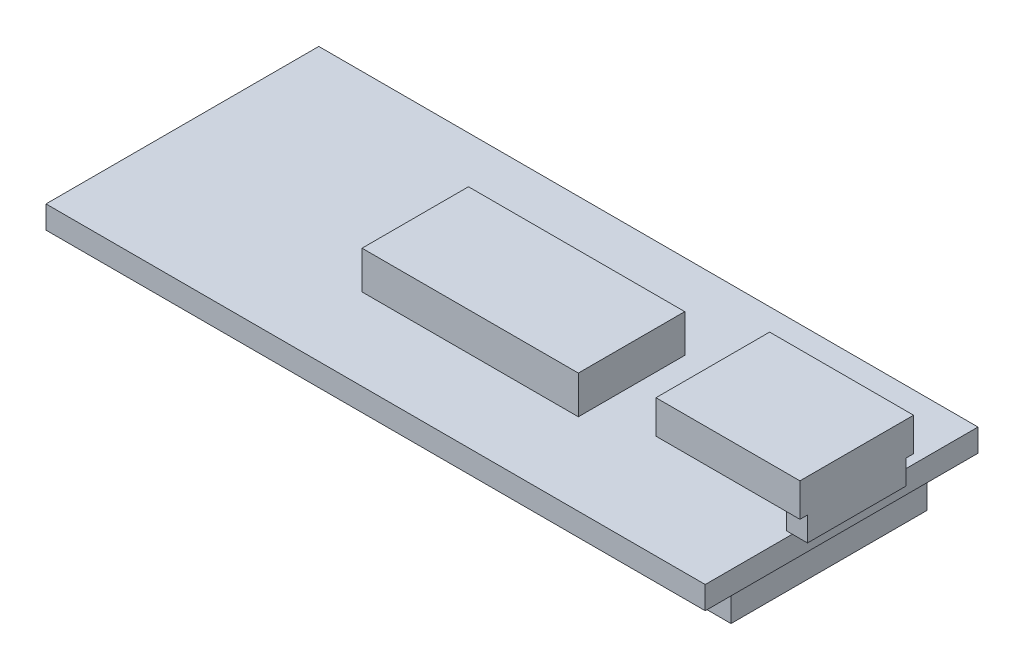
ISO-10303-21;
HEADER;
FILE_DESCRIPTION(('STEP AP214'),'2;1');
FILE_NAME('part.step','',(''),(''),'','','');
FILE_SCHEMA(('AUTOMOTIVE_DESIGN { 1 0 10303 214 1 1 1 1 }'));
ENDSEC;
DATA;
#1=APPLICATION_CONTEXT('core data for automotive mechanical design processes');
#2=APPLICATION_PROTOCOL_DEFINITION('international standard','automotive_design',2000,#1);
#3=PRODUCT_CONTEXT('',#1,'mechanical');
#4=PRODUCT('Part','Part','',(#3));
#5=PRODUCT_RELATED_PRODUCT_CATEGORY('part','',(#4));
#6=PRODUCT_DEFINITION_FORMATION('','',#4);
#7=PRODUCT_DEFINITION_CONTEXT('part definition',#1,'design');
#8=PRODUCT_DEFINITION('design','',#6,#7);
#9=PRODUCT_DEFINITION_SHAPE('','',#8);
#10=(LENGTH_UNIT() NAMED_UNIT(*) SI_UNIT(.MILLI.,.METRE.));
#11=(NAMED_UNIT(*) PLANE_ANGLE_UNIT() SI_UNIT($,.RADIAN.));
#12=(NAMED_UNIT(*) SI_UNIT($,.STERADIAN.) SOLID_ANGLE_UNIT());
#13=UNCERTAINTY_MEASURE_WITH_UNIT(LENGTH_MEASURE(1.E-05),#10,'distance_accuracy_value','');
#14=(GEOMETRIC_REPRESENTATION_CONTEXT(3) GLOBAL_UNCERTAINTY_ASSIGNED_CONTEXT((#13)) GLOBAL_UNIT_ASSIGNED_CONTEXT((#10,
#11,#12)) REPRESENTATION_CONTEXT('',''));
#15=CARTESIAN_POINT('',(0.,0.,0.));
#16=DIRECTION('',(0.,0.,1.));
#17=DIRECTION('',(1.,0.,0.));
#18=AXIS2_PLACEMENT_3D('',#15,#16,#17);
#19=CARTESIAN_POINT('',(0.,1.5,0.));
#20=DIRECTION('',(0.,-1.,0.));
#21=DIRECTION('',(0.,0.,-1.));
#22=AXIS2_PLACEMENT_3D('',#19,#20,#21);
#23=PLANE('',#22);
#24=DIRECTION('',(0.,0.,-1.));
#25=VECTOR('',#24,1.);
#26=CARTESIAN_POINT('',(43.1236382796243,1.5,-5.75));
#27=LINE('',#26,#25);
#28=CARTESIAN_POINT('',(43.1236382796243,1.5,-5.75));
#29=VERTEX_POINT('',#28);
#30=CARTESIAN_POINT('',(43.1236382796243,1.5,-12.25));
#31=VERTEX_POINT('',#30);
#32=EDGE_CURVE('E293',#29,#31,#27,.T.);
#33=ORIENTED_EDGE('',*,*,#32,.T.);
#34=DIRECTION('',(1.,0.,0.));
#35=VECTOR('',#34,1.);
#36=CARTESIAN_POINT('',(43.1236382796243,1.5,-12.25));
#37=LINE('',#36,#35);
#38=CARTESIAN_POINT('',(43.5,1.5,-12.25));
#39=VERTEX_POINT('',#38);
#40=EDGE_CURVE('E294',#31,#39,#37,.T.);
#41=ORIENTED_EDGE('',*,*,#40,.T.);
#42=DIRECTION('',(0.,0.,-1.));
#43=VECTOR('',#42,1.);
#44=CARTESIAN_POINT('',(43.5,1.5,0.));
#45=LINE('',#44,#43);
#46=CARTESIAN_POINT('',(43.5,1.5,-18.));
#47=VERTEX_POINT('',#46);
#48=EDGE_CURVE('E320',#39,#47,#45,.T.);
#49=ORIENTED_EDGE('',*,*,#48,.T.);
#50=DIRECTION('',(-1.,0.,0.));
#51=VECTOR('',#50,1.);
#52=CARTESIAN_POINT('',(0.,1.5,-18.));
#53=LINE('',#52,#51);
#54=CARTESIAN_POINT('',(0.,1.5,-18.));
#55=VERTEX_POINT('',#54);
#56=EDGE_CURVE('E324',#47,#55,#53,.T.);
#57=ORIENTED_EDGE('',*,*,#56,.T.);
#58=DIRECTION('',(0.,0.,1.));
#59=VECTOR('',#58,1.);
#60=CARTESIAN_POINT('',(0.,1.5,0.));
#61=LINE('',#60,#59);
#62=CARTESIAN_POINT('',(0.,1.5,0.));
#63=VERTEX_POINT('',#62);
#64=EDGE_CURVE('E314',#55,#63,#61,.T.);
#65=ORIENTED_EDGE('',*,*,#64,.T.);
#66=DIRECTION('',(1.,0.,0.));
#67=VECTOR('',#66,1.);
#68=CARTESIAN_POINT('',(0.,1.5,0.));
#69=LINE('',#68,#67);
#70=CARTESIAN_POINT('',(43.5,1.5,0.));
#71=VERTEX_POINT('',#70);
#72=EDGE_CURVE('E317',#63,#71,#69,.T.);
#73=ORIENTED_EDGE('',*,*,#72,.T.);
#74=CARTESIAN_POINT('',(43.5,1.5,-5.75));
#75=VERTEX_POINT('',#74);
#76=EDGE_CURVE('E321',#71,#75,#45,.T.);
#77=ORIENTED_EDGE('',*,*,#76,.T.);
#78=DIRECTION('',(1.,0.,0.));
#79=VECTOR('',#78,1.);
#80=CARTESIAN_POINT('',(43.1236382796243,1.5,-5.75));
#81=LINE('',#80,#79);
#82=EDGE_CURVE('E301',#29,#75,#81,.T.);
#83=ORIENTED_EDGE('',*,*,#82,.F.);
#84=EDGE_LOOP('',(#33,#41,#49,#57,#65,#73,#77,#83));
#85=FACE_BOUND('',#84,.T.);
#86=DIRECTION('',(1.,0.,0.));
#87=VECTOR('',#86,1.);
#88=CARTESIAN_POINT('',(15.4577253615621,1.5,-5.39734081677448));
#89=LINE('',#88,#87);
#90=CARTESIAN_POINT('',(15.4577253615621,1.5,-5.39734081677448));
#91=VERTEX_POINT('',#90);
#92=CARTESIAN_POINT('',(29.7306808517931,1.5,-5.39734081677448));
#93=VERTEX_POINT('',#92);
#94=EDGE_CURVE('E195',#91,#93,#89,.T.);
#95=ORIENTED_EDGE('',*,*,#94,.F.);
#96=DIRECTION('',(0.,0.,1.));
#97=VECTOR('',#96,1.);
#98=CARTESIAN_POINT('',(15.4577253615621,1.5,-12.4190841929975));
#99=LINE('',#98,#97);
#100=CARTESIAN_POINT('',(15.4577253615621,1.5,-12.4190841929975));
#101=VERTEX_POINT('',#100);
#102=EDGE_CURVE('E190',#101,#91,#99,.T.);
#103=ORIENTED_EDGE('',*,*,#102,.F.);
#104=DIRECTION('',(1.,0.,0.));
#105=VECTOR('',#104,1.);
#106=CARTESIAN_POINT('',(15.4577253615621,1.5,-12.4190841929975));
#107=LINE('',#106,#105);
#108=CARTESIAN_POINT('',(29.7306808517931,1.5,-12.4190841929975));
#109=VERTEX_POINT('',#108);
#110=EDGE_CURVE('E56',#101,#109,#107,.T.);
#111=ORIENTED_EDGE('',*,*,#110,.T.);
#112=DIRECTION('',(0.,0.,1.));
#113=VECTOR('',#112,1.);
#114=CARTESIAN_POINT('',(29.7306808517931,1.5,-12.4190841929975));
#115=LINE('',#114,#113);
#116=EDGE_CURVE('E51',#109,#93,#115,.T.);
#117=ORIENTED_EDGE('',*,*,#116,.T.);
#118=EDGE_LOOP('',(#95,#103,#111,#117));
#119=FACE_BOUND('',#118,.T.);
#120=ADVANCED_FACE('F36',(#85,#119),#23,.F.);
#121=CARTESIAN_POINT('',(43.1236382796243,5.3,-12.25));
#122=DIRECTION('',(0.,0.,-1.));
#123=DIRECTION('',(-1.,0.,0.));
#124=AXIS2_PLACEMENT_3D('',#121,#122,#123);
#125=PLANE('',#124);
#126=DIRECTION('',(0.,-1.,0.));
#127=VECTOR('',#126,1.);
#128=CARTESIAN_POINT('',(43.1236382796243,5.3,-12.25));
#129=LINE('',#128,#127);
#130=CARTESIAN_POINT('',(43.1236382796243,3.1,-12.25));
#131=VERTEX_POINT('',#130);
#132=EDGE_CURVE('E306',#131,#31,#129,.T.);
#133=ORIENTED_EDGE('',*,*,#132,.F.);
#134=DIRECTION('',(1.,0.,0.));
#135=VECTOR('',#134,1.);
#136=CARTESIAN_POINT('',(43.1236382796243,3.1,-12.25));
#137=LINE('',#136,#135);
#138=CARTESIAN_POINT('',(44.5,3.1,-12.25));
#139=VERTEX_POINT('',#138);
#140=EDGE_CURVE('E286',#131,#139,#137,.T.);
#141=ORIENTED_EDGE('',*,*,#140,.T.);
#142=DIRECTION('',(0.,-1.,0.));
#143=VECTOR('',#142,1.);
#144=CARTESIAN_POINT('',(44.5,5.3,-12.25));
#145=LINE('',#144,#143);
#146=CARTESIAN_POINT('',(44.5,1.5,-12.25));
#147=VERTEX_POINT('',#146);
#148=EDGE_CURVE('E292',#139,#147,#145,.T.);
#149=ORIENTED_EDGE('',*,*,#148,.T.);
#150=EDGE_CURVE('E289',#39,#147,#37,.T.);
#151=ORIENTED_EDGE('',*,*,#150,.F.);
#152=ORIENTED_EDGE('',*,*,#40,.F.);
#153=EDGE_LOOP('',(#133,#141,#149,#151,#152));
#154=FACE_BOUND('',#153,.T.);
#155=ADVANCED_FACE('F370',(#154),#125,.T.);
#156=CARTESIAN_POINT('',(43.1236382796243,5.3,-5.75));
#157=DIRECTION('',(-1.,0.,0.));
#158=DIRECTION('',(0.,0.,1.));
#159=AXIS2_PLACEMENT_3D('',#156,#157,#158);
#160=PLANE('',#159);
#161=DIRECTION('',(0.,-1.,0.));
#162=VECTOR('',#161,1.);
#163=CARTESIAN_POINT('',(43.1236382796243,5.3,-5.75));
#164=LINE('',#163,#162);
#165=CARTESIAN_POINT('',(43.1236382796243,3.1,-5.75));
#166=VERTEX_POINT('',#165);
#167=EDGE_CURVE('E309',#166,#29,#164,.T.);
#168=ORIENTED_EDGE('',*,*,#167,.F.);
#169=DIRECTION('',(0.,0.,-1.));
#170=VECTOR('',#169,1.);
#171=CARTESIAN_POINT('',(43.1236382796243,3.1,-5.75));
#172=LINE('',#171,#170);
#173=EDGE_CURVE('E283',#166,#131,#172,.T.);
#174=ORIENTED_EDGE('',*,*,#173,.T.);
#175=ORIENTED_EDGE('',*,*,#132,.T.);
#176=ORIENTED_EDGE('',*,*,#32,.F.);
#177=EDGE_LOOP('',(#168,#174,#175,#176));
#178=FACE_BOUND('',#177,.T.);
#179=ADVANCED_FACE('F384',(#178),#160,.T.);
#180=CARTESIAN_POINT('',(43.1236382796243,5.3,-5.75));
#181=DIRECTION('',(0.,0.,-1.));
#182=DIRECTION('',(-1.,0.,0.));
#183=AXIS2_PLACEMENT_3D('',#180,#181,#182);
#184=PLANE('',#183);
#185=DIRECTION('',(1.,0.,0.));
#186=VECTOR('',#185,1.);
#187=CARTESIAN_POINT('',(43.1236382796243,3.1,-5.75));
#188=LINE('',#187,#186);
#189=CARTESIAN_POINT('',(44.5,3.1,-5.75));
#190=VERTEX_POINT('',#189);
#191=EDGE_CURVE('E274',#166,#190,#188,.T.);
#192=ORIENTED_EDGE('',*,*,#191,.F.);
#193=ORIENTED_EDGE('',*,*,#167,.T.);
#194=ORIENTED_EDGE('',*,*,#82,.T.);
#195=CARTESIAN_POINT('',(44.5,1.5,-5.75));
#196=VERTEX_POINT('',#195);
#197=EDGE_CURVE('E300',#75,#196,#81,.T.);
#198=ORIENTED_EDGE('',*,*,#197,.T.);
#199=DIRECTION('',(0.,-1.,0.));
#200=VECTOR('',#199,1.);
#201=CARTESIAN_POINT('',(44.5,5.3,-5.75));
#202=LINE('',#201,#200);
#203=EDGE_CURVE('E311',#190,#196,#202,.T.);
#204=ORIENTED_EDGE('',*,*,#203,.F.);
#205=EDGE_LOOP('',(#192,#193,#194,#198,#204));
#206=FACE_BOUND('',#205,.T.);
#207=ADVANCED_FACE('F379',(#206),#184,.F.);
#208=CARTESIAN_POINT('',(0.,1.5,0.));
#209=DIRECTION('',(1.,0.,0.));
#210=DIRECTION('',(0.,0.,-1.));
#211=AXIS2_PLACEMENT_3D('',#208,#209,#210);
#212=PLANE('',#211);
#213=DIRECTION('',(0.,0.,1.));
#214=VECTOR('',#213,1.);
#215=CARTESIAN_POINT('',(0.,0.,0.));
#216=LINE('',#215,#214);
#217=CARTESIAN_POINT('',(0.,0.,-18.));
#218=VERTEX_POINT('',#217);
#219=CARTESIAN_POINT('',(0.,0.,0.));
#220=VERTEX_POINT('',#219);
#221=EDGE_CURVE('E308',#218,#220,#216,.T.);
#222=ORIENTED_EDGE('',*,*,#221,.T.);
#223=DIRECTION('',(0.,-1.,0.));
#224=VECTOR('',#223,1.);
#225=CARTESIAN_POINT('',(0.,1.5,0.));
#226=LINE('',#225,#224);
#227=EDGE_CURVE('E11',#63,#220,#226,.T.);
#228=ORIENTED_EDGE('',*,*,#227,.F.);
#229=ORIENTED_EDGE('',*,*,#64,.F.);
#230=DIRECTION('',(0.,-1.,0.));
#231=VECTOR('',#230,1.);
#232=CARTESIAN_POINT('',(0.,1.5,-18.));
#233=LINE('',#232,#231);
#234=EDGE_CURVE('E327',#55,#218,#233,.T.);
#235=ORIENTED_EDGE('',*,*,#234,.T.);
#236=EDGE_LOOP('',(#222,#228,#229,#235));
#237=FACE_BOUND('',#236,.T.);
#238=ADVANCED_FACE('F38',(#237),#212,.F.);
#239=CARTESIAN_POINT('',(0.,1.5,0.));
#240=DIRECTION('',(0.,0.,-1.));
#241=DIRECTION('',(-1.,0.,0.));
#242=AXIS2_PLACEMENT_3D('',#239,#240,#241);
#243=PLANE('',#242);
#244=DIRECTION('',(1.,0.,0.));
#245=VECTOR('',#244,1.);
#246=CARTESIAN_POINT('',(0.,0.,0.));
#247=LINE('',#246,#245);
#248=CARTESIAN_POINT('',(43.5,0.,0.));
#249=VERTEX_POINT('',#248);
#250=EDGE_CURVE('E330',#220,#249,#247,.T.);
#251=ORIENTED_EDGE('',*,*,#250,.T.);
#252=DIRECTION('',(0.,-1.,0.));
#253=VECTOR('',#252,1.);
#254=CARTESIAN_POINT('',(43.5,1.5,0.));
#255=LINE('',#254,#253);
#256=EDGE_CURVE('E44',#71,#249,#255,.T.);
#257=ORIENTED_EDGE('',*,*,#256,.F.);
#258=ORIENTED_EDGE('',*,*,#72,.F.);
#259=ORIENTED_EDGE('',*,*,#227,.T.);
#260=EDGE_LOOP('',(#251,#257,#258,#259));
#261=FACE_BOUND('',#260,.T.);
#262=ADVANCED_FACE('F424',(#261),#243,.F.);
#263=CARTESIAN_POINT('',(43.5,1.5,0.));
#264=DIRECTION('',(-1.,0.,0.));
#265=DIRECTION('',(0.,0.,1.));
#266=AXIS2_PLACEMENT_3D('',#263,#264,#265);
#267=PLANE('',#266);
#268=DIRECTION('',(0.,0.,-1.));
#269=VECTOR('',#268,1.);
#270=CARTESIAN_POINT('',(43.5,0.,0.));
#271=LINE('',#270,#269);
#272=CARTESIAN_POINT('',(43.5,0.,-18.));
#273=VERTEX_POINT('',#272);
#274=EDGE_CURVE('E332',#249,#273,#271,.T.);
#275=ORIENTED_EDGE('',*,*,#274,.T.);
#276=DIRECTION('',(0.,-1.,0.));
#277=VECTOR('',#276,1.);
#278=CARTESIAN_POINT('',(43.5,1.5,-18.));
#279=LINE('',#278,#277);
#280=EDGE_CURVE('E337',#47,#273,#279,.T.);
#281=ORIENTED_EDGE('',*,*,#280,.F.);
#282=ORIENTED_EDGE('',*,*,#48,.F.);
#283=EDGE_CURVE('E325',#75,#39,#45,.T.);
#284=ORIENTED_EDGE('',*,*,#283,.F.);
#285=ORIENTED_EDGE('',*,*,#76,.F.);
#286=ORIENTED_EDGE('',*,*,#256,.T.);
#287=EDGE_LOOP('',(#275,#281,#282,#284,#285,#286));
#288=FACE_BOUND('',#287,.T.);
#289=ADVANCED_FACE('F344',(#288),#267,.F.);
#290=CARTESIAN_POINT('',(0.,1.5,-18.));
#291=DIRECTION('',(0.,0.,1.));
#292=DIRECTION('',(1.,0.,0.));
#293=AXIS2_PLACEMENT_3D('',#290,#291,#292);
#294=PLANE('',#293);
#295=DIRECTION('',(-1.,0.,0.));
#296=VECTOR('',#295,1.);
#297=CARTESIAN_POINT('',(0.,0.,-18.));
#298=LINE('',#297,#296);
#299=EDGE_CURVE('E318',#273,#218,#298,.T.);
#300=ORIENTED_EDGE('',*,*,#299,.T.);
#301=ORIENTED_EDGE('',*,*,#234,.F.);
#302=ORIENTED_EDGE('',*,*,#56,.F.);
#303=ORIENTED_EDGE('',*,*,#280,.T.);
#304=EDGE_LOOP('',(#300,#301,#302,#303));
#305=FACE_BOUND('',#304,.T.);
#306=ADVANCED_FACE('F354',(#305),#294,.F.);
#307=CARTESIAN_POINT('',(0.,0.,0.));
#308=DIRECTION('',(0.,-1.,0.));
#309=DIRECTION('',(0.,0.,-1.));
#310=AXIS2_PLACEMENT_3D('',#307,#308,#309);
#311=PLANE('',#310);
#312=DIRECTION('',(0.,0.,-1.));
#313=VECTOR('',#312,1.);
#314=CARTESIAN_POINT('',(2.47704764683477,0.,-15.5464770542721));
#315=LINE('',#314,#313);
#316=CARTESIAN_POINT('',(2.47704764683477,0.,-2.61819635693428));
#317=VERTEX_POINT('',#316);
#318=CARTESIAN_POINT('',(2.47704764683477,0.,-15.5464770542721));
#319=VERTEX_POINT('',#318);
#320=EDGE_CURVE('E197',#317,#319,#315,.T.);
#321=ORIENTED_EDGE('',*,*,#320,.F.);
#322=DIRECTION('',(-1.,0.,0.));
#323=VECTOR('',#322,1.);
#324=CARTESIAN_POINT('',(2.47704764683477,0.,-2.61819635693428));
#325=LINE('',#324,#323);
#326=CARTESIAN_POINT('',(42.5846508932892,0.,-2.61819635693428));
#327=VERTEX_POINT('',#326);
#328=EDGE_CURVE('E221',#327,#317,#325,.T.);
#329=ORIENTED_EDGE('',*,*,#328,.F.);
#330=DIRECTION('',(0.,0.,1.));
#331=VECTOR('',#330,1.);
#332=CARTESIAN_POINT('',(42.5846508932892,0.,-15.5464770542721));
#333=LINE('',#332,#331);
#334=CARTESIAN_POINT('',(42.5846508932892,0.,-15.5464770542721));
#335=VERTEX_POINT('',#334);
#336=EDGE_CURVE('E233',#335,#327,#333,.T.);
#337=ORIENTED_EDGE('',*,*,#336,.F.);
#338=DIRECTION('',(1.,0.,0.));
#339=VECTOR('',#338,1.);
#340=CARTESIAN_POINT('',(2.47704764683477,0.,-15.5464770542721));
#341=LINE('',#340,#339);
#342=EDGE_CURVE('E230',#319,#335,#341,.T.);
#343=ORIENTED_EDGE('',*,*,#342,.F.);
#344=EDGE_LOOP('',(#321,#329,#337,#343));
#345=FACE_BOUND('',#344,.T.);
#346=ORIENTED_EDGE('',*,*,#221,.F.);
#347=ORIENTED_EDGE('',*,*,#299,.F.);
#348=ORIENTED_EDGE('',*,*,#274,.F.);
#349=ORIENTED_EDGE('',*,*,#250,.F.);
#350=EDGE_LOOP('',(#346,#347,#348,#349));
#351=FACE_BOUND('',#350,.T.);
#352=ADVANCED_FACE('F351',(#345,#351),#311,.T.);
#353=CARTESIAN_POINT('',(0.,1.5,0.));
#354=DIRECTION('',(0.,1.,0.));
#355=DIRECTION('',(0.,0.,1.));
#356=AXIS2_PLACEMENT_3D('',#353,#354,#355);
#357=PLANE('',#356);
#358=ORIENTED_EDGE('',*,*,#197,.F.);
#359=ORIENTED_EDGE('',*,*,#283,.T.);
#360=ORIENTED_EDGE('',*,*,#150,.T.);
#361=DIRECTION('',(0.,0.,-1.));
#362=VECTOR('',#361,1.);
#363=CARTESIAN_POINT('',(44.5,1.5,-5.75));
#364=LINE('',#363,#362);
#365=EDGE_CURVE('E297',#196,#147,#364,.T.);
#366=ORIENTED_EDGE('',*,*,#365,.F.);
#367=EDGE_LOOP('',(#358,#359,#360,#366));
#368=FACE_BOUND('',#367,.T.);
#369=ADVANCED_FACE('F365',(#368),#357,.F.);
#370=CARTESIAN_POINT('',(44.5,5.3,-5.75));
#371=DIRECTION('',(-1.,0.,0.));
#372=DIRECTION('',(0.,0.,1.));
#373=AXIS2_PLACEMENT_3D('',#370,#371,#372);
#374=PLANE('',#373);
#375=DIRECTION('',(0.,0.,-1.));
#376=VECTOR('',#375,1.);
#377=CARTESIAN_POINT('',(44.5,5.3,-5.75));
#378=LINE('',#377,#376);
#379=CARTESIAN_POINT('',(44.5,5.3,-5.25));
#380=VERTEX_POINT('',#379);
#381=CARTESIAN_POINT('',(44.5,5.3,-12.75));
#382=VERTEX_POINT('',#381);
#383=EDGE_CURVE('E290',#380,#382,#378,.T.);
#384=ORIENTED_EDGE('',*,*,#383,.F.);
#385=DIRECTION('',(0.,1.,0.));
#386=VECTOR('',#385,1.);
#387=CARTESIAN_POINT('',(44.5,3.1,-5.25));
#388=LINE('',#387,#386);
#389=CARTESIAN_POINT('',(44.5,3.1,-5.25));
#390=VERTEX_POINT('',#389);
#391=EDGE_CURVE('E278',#390,#380,#388,.T.);
#392=ORIENTED_EDGE('',*,*,#391,.F.);
#393=DIRECTION('',(0.,0.,-1.));
#394=VECTOR('',#393,1.);
#395=CARTESIAN_POINT('',(44.5,3.1,-12.75));
#396=LINE('',#395,#394);
#397=EDGE_CURVE('E258',#390,#190,#396,.T.);
#398=ORIENTED_EDGE('',*,*,#397,.T.);
#399=ORIENTED_EDGE('',*,*,#203,.T.);
#400=ORIENTED_EDGE('',*,*,#365,.T.);
#401=ORIENTED_EDGE('',*,*,#148,.F.);
#402=CARTESIAN_POINT('',(44.5,3.1,-12.75));
#403=VERTEX_POINT('',#402);
#404=EDGE_CURVE('E257',#139,#403,#396,.T.);
#405=ORIENTED_EDGE('',*,*,#404,.T.);
#406=DIRECTION('',(0.,1.,0.));
#407=VECTOR('',#406,1.);
#408=CARTESIAN_POINT('',(44.5,3.1,-12.75));
#409=LINE('',#408,#407);
#410=EDGE_CURVE('E275',#403,#382,#409,.T.);
#411=ORIENTED_EDGE('',*,*,#410,.T.);
#412=EDGE_LOOP('',(#384,#392,#398,#399,#400,#401,#405,#411));
#413=FACE_BOUND('',#412,.T.);
#414=ADVANCED_FACE('F373',(#413),#374,.F.);
#415=CARTESIAN_POINT('',(0.,5.3,0.));
#416=DIRECTION('',(0.,1.,0.));
#417=DIRECTION('',(0.,0.,1.));
#418=AXIS2_PLACEMENT_3D('',#415,#416,#417);
#419=PLANE('',#418);
#420=ORIENTED_EDGE('',*,*,#383,.T.);
#421=DIRECTION('',(-1.,0.,0.));
#422=VECTOR('',#421,1.);
#423=CARTESIAN_POINT('',(35.,5.3,-12.75));
#424=LINE('',#423,#422);
#425=CARTESIAN_POINT('',(35.,5.3,-12.75));
#426=VERTEX_POINT('',#425);
#427=EDGE_CURVE('E254',#382,#426,#424,.T.);
#428=ORIENTED_EDGE('',*,*,#427,.T.);
#429=DIRECTION('',(0.,0.,1.));
#430=VECTOR('',#429,1.);
#431=CARTESIAN_POINT('',(35.,5.3,-12.75));
#432=LINE('',#431,#430);
#433=CARTESIAN_POINT('',(35.,5.3,-5.25));
#434=VERTEX_POINT('',#433);
#435=EDGE_CURVE('E249',#426,#434,#432,.T.);
#436=ORIENTED_EDGE('',*,*,#435,.T.);
#437=DIRECTION('',(1.,0.,0.));
#438=VECTOR('',#437,1.);
#439=CARTESIAN_POINT('',(35.,5.3,-5.25));
#440=LINE('',#439,#438);
#441=EDGE_CURVE('E267',#434,#380,#440,.T.);
#442=ORIENTED_EDGE('',*,*,#441,.T.);
#443=EDGE_LOOP('',(#420,#428,#436,#442));
#444=FACE_BOUND('',#443,.T.);
#445=ADVANCED_FACE('F398',(#444),#419,.T.);
#446=CARTESIAN_POINT('',(35.,3.1,-12.75));
#447=DIRECTION('',(-1.,0.,0.));
#448=DIRECTION('',(0.,0.,1.));
#449=AXIS2_PLACEMENT_3D('',#446,#447,#448);
#450=PLANE('',#449);
#451=ORIENTED_EDGE('',*,*,#435,.F.);
#452=DIRECTION('',(0.,1.,0.));
#453=VECTOR('',#452,1.);
#454=CARTESIAN_POINT('',(35.,3.1,-12.75));
#455=LINE('',#454,#453);
#456=CARTESIAN_POINT('',(35.,3.1,-12.75));
#457=VERTEX_POINT('',#456);
#458=EDGE_CURVE('E272',#457,#426,#455,.T.);
#459=ORIENTED_EDGE('',*,*,#458,.F.);
#460=DIRECTION('',(0.,0.,1.));
#461=VECTOR('',#460,1.);
#462=CARTESIAN_POINT('',(35.,3.1,-12.75));
#463=LINE('',#462,#461);
#464=CARTESIAN_POINT('',(35.,3.1,-5.25));
#465=VERTEX_POINT('',#464);
#466=EDGE_CURVE('E250',#457,#465,#463,.T.);
#467=ORIENTED_EDGE('',*,*,#466,.T.);
#468=DIRECTION('',(0.,1.,0.));
#469=VECTOR('',#468,1.);
#470=CARTESIAN_POINT('',(35.,3.1,-5.25));
#471=LINE('',#470,#469);
#472=EDGE_CURVE('E264',#465,#434,#471,.T.);
#473=ORIENTED_EDGE('',*,*,#472,.T.);
#474=EDGE_LOOP('',(#451,#459,#467,#473));
#475=FACE_BOUND('',#474,.T.);
#476=ADVANCED_FACE('F400',(#475),#450,.T.);
#477=CARTESIAN_POINT('',(35.,3.1,-12.75));
#478=DIRECTION('',(0.,0.,-1.));
#479=DIRECTION('',(-1.,0.,0.));
#480=AXIS2_PLACEMENT_3D('',#477,#478,#479);
#481=PLANE('',#480);
#482=ORIENTED_EDGE('',*,*,#427,.F.);
#483=ORIENTED_EDGE('',*,*,#410,.F.);
#484=DIRECTION('',(-1.,0.,0.));
#485=VECTOR('',#484,1.);
#486=CARTESIAN_POINT('',(35.,3.1,-12.75));
#487=LINE('',#486,#485);
#488=EDGE_CURVE('E261',#403,#457,#487,.T.);
#489=ORIENTED_EDGE('',*,*,#488,.T.);
#490=ORIENTED_EDGE('',*,*,#458,.T.);
#491=EDGE_LOOP('',(#482,#483,#489,#490));
#492=FACE_BOUND('',#491,.T.);
#493=ADVANCED_FACE('F392',(#492),#481,.T.);
#494=CARTESIAN_POINT('',(35.,3.1,-5.25));
#495=DIRECTION('',(0.,0.,1.));
#496=DIRECTION('',(1.,0.,0.));
#497=AXIS2_PLACEMENT_3D('',#494,#495,#496);
#498=PLANE('',#497);
#499=ORIENTED_EDGE('',*,*,#441,.F.);
#500=ORIENTED_EDGE('',*,*,#472,.F.);
#501=DIRECTION('',(1.,0.,0.));
#502=VECTOR('',#501,1.);
#503=CARTESIAN_POINT('',(35.,3.1,-5.25));
#504=LINE('',#503,#502);
#505=EDGE_CURVE('E253',#465,#390,#504,.T.);
#506=ORIENTED_EDGE('',*,*,#505,.T.);
#507=ORIENTED_EDGE('',*,*,#391,.T.);
#508=EDGE_LOOP('',(#499,#500,#506,#507));
#509=FACE_BOUND('',#508,.T.);
#510=ADVANCED_FACE('F397',(#509),#498,.T.);
#511=CARTESIAN_POINT('',(0.,3.1,0.));
#512=DIRECTION('',(0.,1.,0.));
#513=DIRECTION('',(0.,0.,1.));
#514=AXIS2_PLACEMENT_3D('',#511,#512,#513);
#515=PLANE('',#514);
#516=ORIENTED_EDGE('',*,*,#140,.F.);
#517=ORIENTED_EDGE('',*,*,#173,.F.);
#518=ORIENTED_EDGE('',*,*,#191,.T.);
#519=ORIENTED_EDGE('',*,*,#397,.F.);
#520=ORIENTED_EDGE('',*,*,#505,.F.);
#521=ORIENTED_EDGE('',*,*,#466,.F.);
#522=ORIENTED_EDGE('',*,*,#488,.F.);
#523=ORIENTED_EDGE('',*,*,#404,.F.);
#524=EDGE_LOOP('',(#516,#517,#518,#519,#520,#521,#522,#523));
#525=FACE_BOUND('',#524,.T.);
#526=ADVANCED_FACE('F386',(#525),#515,.F.);
#527=CARTESIAN_POINT('',(2.47704764683477,-2.5,-15.5464770542721));
#528=DIRECTION('',(1.,0.,0.));
#529=DIRECTION('',(0.,0.,-1.));
#530=AXIS2_PLACEMENT_3D('',#527,#528,#529);
#531=PLANE('',#530);
#532=ORIENTED_EDGE('',*,*,#320,.T.);
#533=DIRECTION('',(0.,1.,0.));
#534=VECTOR('',#533,1.);
#535=CARTESIAN_POINT('',(2.47704764683477,-2.5,-15.5464770542721));
#536=LINE('',#535,#534);
#537=CARTESIAN_POINT('',(2.47704764683477,-2.5,-15.5464770542721));
#538=VERTEX_POINT('',#537);
#539=EDGE_CURVE('E246',#538,#319,#536,.T.);
#540=ORIENTED_EDGE('',*,*,#539,.F.);
#541=DIRECTION('',(0.,0.,-1.));
#542=VECTOR('',#541,1.);
#543=CARTESIAN_POINT('',(2.47704764683477,-2.5,-15.5464770542721));
#544=LINE('',#543,#542);
#545=CARTESIAN_POINT('',(2.47704764683477,-2.5,-2.61819635693428));
#546=VERTEX_POINT('',#545);
#547=EDGE_CURVE('E217',#546,#538,#544,.T.);
#548=ORIENTED_EDGE('',*,*,#547,.F.);
#549=DIRECTION('',(0.,1.,0.));
#550=VECTOR('',#549,1.);
#551=CARTESIAN_POINT('',(2.47704764683477,-2.5,-2.61819635693428));
#552=LINE('',#551,#550);
#553=EDGE_CURVE('E227',#546,#317,#552,.T.);
#554=ORIENTED_EDGE('',*,*,#553,.T.);
#555=EDGE_LOOP('',(#532,#540,#548,#554));
#556=FACE_BOUND('',#555,.T.);
#557=ADVANCED_FACE('F481',(#556),#531,.F.);
#558=CARTESIAN_POINT('',(2.47704764683477,-2.5,-15.5464770542721));
#559=DIRECTION('',(0.,0.,1.));
#560=DIRECTION('',(1.,0.,0.));
#561=AXIS2_PLACEMENT_3D('',#558,#559,#560);
#562=PLANE('',#561);
#563=ORIENTED_EDGE('',*,*,#342,.T.);
#564=DIRECTION('',(0.,1.,0.));
#565=VECTOR('',#564,1.);
#566=CARTESIAN_POINT('',(42.5846508932892,-2.5,-15.5464770542721));
#567=LINE('',#566,#565);
#568=CARTESIAN_POINT('',(42.5846508932892,-2.5,-15.5464770542721));
#569=VERTEX_POINT('',#568);
#570=EDGE_CURVE('E243',#569,#335,#567,.T.);
#571=ORIENTED_EDGE('',*,*,#570,.F.);
#572=DIRECTION('',(1.,0.,0.));
#573=VECTOR('',#572,1.);
#574=CARTESIAN_POINT('',(2.47704764683477,-2.5,-15.5464770542721));
#575=LINE('',#574,#573);
#576=EDGE_CURVE('E220',#538,#569,#575,.T.);
#577=ORIENTED_EDGE('',*,*,#576,.F.);
#578=ORIENTED_EDGE('',*,*,#539,.T.);
#579=EDGE_LOOP('',(#563,#571,#577,#578));
#580=FACE_BOUND('',#579,.T.);
#581=ADVANCED_FACE('F486',(#580),#562,.F.);
#582=CARTESIAN_POINT('',(42.5846508932892,-2.5,-15.5464770542721));
#583=DIRECTION('',(-1.,0.,0.));
#584=DIRECTION('',(0.,0.,1.));
#585=AXIS2_PLACEMENT_3D('',#582,#583,#584);
#586=PLANE('',#585);
#587=ORIENTED_EDGE('',*,*,#336,.T.);
#588=DIRECTION('',(0.,1.,0.));
#589=VECTOR('',#588,1.);
#590=CARTESIAN_POINT('',(42.5846508932892,-2.5,-2.61819635693428));
#591=LINE('',#590,#589);
#592=CARTESIAN_POINT('',(42.5846508932892,-2.5,-2.61819635693428));
#593=VERTEX_POINT('',#592);
#594=EDGE_CURVE('E240',#593,#327,#591,.T.);
#595=ORIENTED_EDGE('',*,*,#594,.F.);
#596=DIRECTION('',(0.,0.,1.));
#597=VECTOR('',#596,1.);
#598=CARTESIAN_POINT('',(42.5846508932892,-2.5,-15.5464770542721));
#599=LINE('',#598,#597);
#600=EDGE_CURVE('E223',#569,#593,#599,.T.);
#601=ORIENTED_EDGE('',*,*,#600,.F.);
#602=ORIENTED_EDGE('',*,*,#570,.T.);
#603=EDGE_LOOP('',(#587,#595,#601,#602));
#604=FACE_BOUND('',#603,.T.);
#605=ADVANCED_FACE('F497',(#604),#586,.F.);
#606=CARTESIAN_POINT('',(2.47704764683477,-2.5,-2.61819635693428));
#607=DIRECTION('',(0.,0.,-1.));
#608=DIRECTION('',(-1.,0.,0.));
#609=AXIS2_PLACEMENT_3D('',#606,#607,#608);
#610=PLANE('',#609);
#611=ORIENTED_EDGE('',*,*,#328,.T.);
#612=ORIENTED_EDGE('',*,*,#553,.F.);
#613=DIRECTION('',(-1.,0.,0.));
#614=VECTOR('',#613,1.);
#615=CARTESIAN_POINT('',(2.47704764683477,-2.5,-2.61819635693428));
#616=LINE('',#615,#614);
#617=EDGE_CURVE('E225',#593,#546,#616,.T.);
#618=ORIENTED_EDGE('',*,*,#617,.F.);
#619=ORIENTED_EDGE('',*,*,#594,.T.);
#620=EDGE_LOOP('',(#611,#612,#618,#619));
#621=FACE_BOUND('',#620,.T.);
#622=ADVANCED_FACE('F507',(#621),#610,.F.);
#623=CARTESIAN_POINT('',(0.,-2.5,0.));
#624=DIRECTION('',(0.,1.,0.));
#625=DIRECTION('',(0.,0.,1.));
#626=AXIS2_PLACEMENT_3D('',#623,#624,#625);
#627=PLANE('',#626);
#628=ORIENTED_EDGE('',*,*,#547,.T.);
#629=ORIENTED_EDGE('',*,*,#576,.T.);
#630=ORIENTED_EDGE('',*,*,#600,.T.);
#631=ORIENTED_EDGE('',*,*,#617,.T.);
#632=EDGE_LOOP('',(#628,#629,#630,#631));
#633=FACE_BOUND('',#632,.T.);
#634=ADVANCED_FACE('F517',(#633),#627,.F.);
#635=CARTESIAN_POINT('',(15.4577253615621,4.,-5.39734081677448));
#636=DIRECTION('',(0.,0.,-1.));
#637=DIRECTION('',(-1.,0.,0.));
#638=AXIS2_PLACEMENT_3D('',#635,#636,#637);
#639=PLANE('',#638);
#640=ORIENTED_EDGE('',*,*,#94,.T.);
#641=DIRECTION('',(0.,-1.,0.));
#642=VECTOR('',#641,1.);
#643=CARTESIAN_POINT('',(29.7306808517931,4.,-5.39734081677448));
#644=LINE('',#643,#642);
#645=CARTESIAN_POINT('',(29.7306808517931,4.,-5.39734081677448));
#646=VERTEX_POINT('',#645);
#647=EDGE_CURVE('E193',#646,#93,#644,.T.);
#648=ORIENTED_EDGE('',*,*,#647,.F.);
#649=DIRECTION('',(1.,0.,0.));
#650=VECTOR('',#649,1.);
#651=CARTESIAN_POINT('',(15.4577253615621,4.,-5.39734081677448));
#652=LINE('',#651,#650);
#653=CARTESIAN_POINT('',(15.4577253615621,4.,-5.39734081677448));
#654=VERTEX_POINT('',#653);
#655=EDGE_CURVE('E178',#654,#646,#652,.T.);
#656=ORIENTED_EDGE('',*,*,#655,.F.);
#657=DIRECTION('',(0.,-1.,0.));
#658=VECTOR('',#657,1.);
#659=CARTESIAN_POINT('',(15.4577253615621,4.,-5.39734081677448));
#660=LINE('',#659,#658);
#661=EDGE_CURVE('E206',#654,#91,#660,.T.);
#662=ORIENTED_EDGE('',*,*,#661,.T.);
#663=EDGE_LOOP('',(#640,#648,#656,#662));
#664=FACE_BOUND('',#663,.T.);
#665=ADVANCED_FACE('F194',(#664),#639,.F.);
#666=CARTESIAN_POINT('',(29.7306808517931,4.,-12.4190841929975));
#667=DIRECTION('',(1.,0.,0.));
#668=DIRECTION('',(0.,0.,-1.));
#669=AXIS2_PLACEMENT_3D('',#666,#667,#668);
#670=PLANE('',#669);
#671=ORIENTED_EDGE('',*,*,#116,.F.);
#672=DIRECTION('',(0.,-1.,0.));
#673=VECTOR('',#672,1.);
#674=CARTESIAN_POINT('',(29.7306808517931,4.,-12.4190841929975));
#675=LINE('',#674,#673);
#676=CARTESIAN_POINT('',(29.7306808517931,4.,-12.4190841929975));
#677=VERTEX_POINT('',#676);
#678=EDGE_CURVE('E198',#677,#109,#675,.T.);
#679=ORIENTED_EDGE('',*,*,#678,.F.);
#680=DIRECTION('',(0.,0.,1.));
#681=VECTOR('',#680,1.);
#682=CARTESIAN_POINT('',(29.7306808517931,4.,-12.4190841929975));
#683=LINE('',#682,#681);
#684=EDGE_CURVE('E183',#677,#646,#683,.T.);
#685=ORIENTED_EDGE('',*,*,#684,.T.);
#686=ORIENTED_EDGE('',*,*,#647,.T.);
#687=EDGE_LOOP('',(#671,#679,#685,#686));
#688=FACE_BOUND('',#687,.T.);
#689=ADVANCED_FACE('F200',(#688),#670,.T.);
#690=CARTESIAN_POINT('',(15.4577253615621,4.,-12.4190841929975));
#691=DIRECTION('',(0.,0.,-1.));
#692=DIRECTION('',(-1.,0.,0.));
#693=AXIS2_PLACEMENT_3D('',#690,#691,#692);
#694=PLANE('',#693);
#695=ORIENTED_EDGE('',*,*,#110,.F.);
#696=DIRECTION('',(0.,-1.,0.));
#697=VECTOR('',#696,1.);
#698=CARTESIAN_POINT('',(15.4577253615621,4.,-12.4190841929975));
#699=LINE('',#698,#697);
#700=CARTESIAN_POINT('',(15.4577253615621,4.,-12.4190841929975));
#701=VERTEX_POINT('',#700);
#702=EDGE_CURVE('E213',#701,#101,#699,.T.);
#703=ORIENTED_EDGE('',*,*,#702,.F.);
#704=DIRECTION('',(1.,0.,0.));
#705=VECTOR('',#704,1.);
#706=CARTESIAN_POINT('',(15.4577253615621,4.,-12.4190841929975));
#707=LINE('',#706,#705);
#708=EDGE_CURVE('E201',#701,#677,#707,.T.);
#709=ORIENTED_EDGE('',*,*,#708,.T.);
#710=ORIENTED_EDGE('',*,*,#678,.T.);
#711=EDGE_LOOP('',(#695,#703,#709,#710));
#712=FACE_BOUND('',#711,.T.);
#713=ADVANCED_FACE('F548',(#712),#694,.T.);
#714=CARTESIAN_POINT('',(15.4577253615621,4.,-12.4190841929975));
#715=DIRECTION('',(1.,0.,0.));
#716=DIRECTION('',(0.,0.,-1.));
#717=AXIS2_PLACEMENT_3D('',#714,#715,#716);
#718=PLANE('',#717);
#719=ORIENTED_EDGE('',*,*,#102,.T.);
#720=ORIENTED_EDGE('',*,*,#661,.F.);
#721=DIRECTION('',(0.,0.,1.));
#722=VECTOR('',#721,1.);
#723=CARTESIAN_POINT('',(15.4577253615621,4.,-12.4190841929975));
#724=LINE('',#723,#722);
#725=EDGE_CURVE('E186',#701,#654,#724,.T.);
#726=ORIENTED_EDGE('',*,*,#725,.F.);
#727=ORIENTED_EDGE('',*,*,#702,.T.);
#728=EDGE_LOOP('',(#719,#720,#726,#727));
#729=FACE_BOUND('',#728,.T.);
#730=ADVANCED_FACE('F557',(#729),#718,.F.);
#731=CARTESIAN_POINT('',(0.,4.,0.));
#732=DIRECTION('',(0.,-1.,0.));
#733=DIRECTION('',(0.,0.,-1.));
#734=AXIS2_PLACEMENT_3D('',#731,#732,#733);
#735=PLANE('',#734);
#736=ORIENTED_EDGE('',*,*,#655,.T.);
#737=ORIENTED_EDGE('',*,*,#684,.F.);
#738=ORIENTED_EDGE('',*,*,#708,.F.);
#739=ORIENTED_EDGE('',*,*,#725,.T.);
#740=EDGE_LOOP('',(#736,#737,#738,#739));
#741=FACE_BOUND('',#740,.T.);
#742=ADVANCED_FACE('F180',(#741),#735,.F.);
#743=CLOSED_SHELL('',(#120,#155,#179,#207,#238,#262,#289,#306,#352,#369,#414,#445,#476,#493,
#510,#526,#557,#581,#605,#622,#634,#665,#689,#713,#730,#742));
#744=MANIFOLD_SOLID_BREP('B2',#743);
#745=ADVANCED_BREP_SHAPE_REPRESENTATION('',(#18,#744),#14);
#746=SHAPE_DEFINITION_REPRESENTATION(#9,#745);
ENDSEC;
END-ISO-10303-21;
